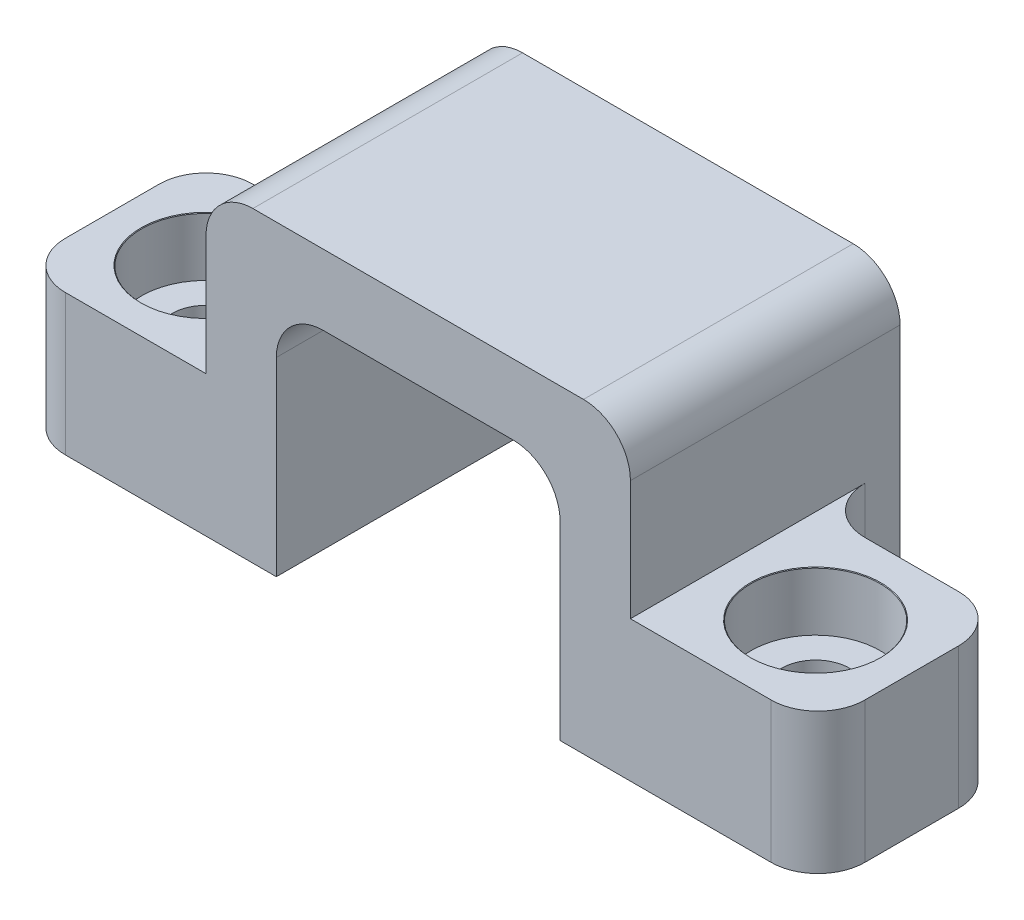
ISO-10303-21;
HEADER;
FILE_DESCRIPTION(('STEP AP214'),'2;1');
FILE_NAME('part.step','',(''),(''),'','','');
FILE_SCHEMA(('AUTOMOTIVE_DESIGN { 1 0 10303 214 1 1 1 1 }'));
ENDSEC;
DATA;
#1=APPLICATION_CONTEXT('core data for automotive mechanical design processes');
#2=APPLICATION_PROTOCOL_DEFINITION('international standard','automotive_design',2000,#1);
#3=PRODUCT_CONTEXT('',#1,'mechanical');
#4=PRODUCT('Part','Part','',(#3));
#5=PRODUCT_RELATED_PRODUCT_CATEGORY('part','',(#4));
#6=PRODUCT_DEFINITION_FORMATION('','',#4);
#7=PRODUCT_DEFINITION_CONTEXT('part definition',#1,'design');
#8=PRODUCT_DEFINITION('design','',#6,#7);
#9=PRODUCT_DEFINITION_SHAPE('','',#8);
#10=(LENGTH_UNIT() NAMED_UNIT(*) SI_UNIT(.MILLI.,.METRE.));
#11=(NAMED_UNIT(*) PLANE_ANGLE_UNIT() SI_UNIT($,.RADIAN.));
#12=(NAMED_UNIT(*) SI_UNIT($,.STERADIAN.) SOLID_ANGLE_UNIT());
#13=UNCERTAINTY_MEASURE_WITH_UNIT(LENGTH_MEASURE(1.E-05),#10,'distance_accuracy_value','');
#14=(GEOMETRIC_REPRESENTATION_CONTEXT(3) GLOBAL_UNCERTAINTY_ASSIGNED_CONTEXT((#13)) GLOBAL_UNIT_ASSIGNED_CONTEXT((#10,
#11,#12)) REPRESENTATION_CONTEXT('',''));
#15=CARTESIAN_POINT('',(0.,0.,0.));
#16=DIRECTION('',(0.,0.,1.));
#17=DIRECTION('',(1.,0.,0.));
#18=AXIS2_PLACEMENT_3D('',#15,#16,#17);
#19=CARTESIAN_POINT('',(9.05,0.,11.5));
#20=DIRECTION('',(-1.,0.,0.));
#21=DIRECTION('',(0.,-1.,0.));
#22=AXIS2_PLACEMENT_3D('',#19,#20,#21);
#23=PLANE('',#22);
#24=DIRECTION('',(0.,1.,0.));
#25=VECTOR('',#24,1.);
#26=CARTESIAN_POINT('',(9.05,0.,0.));
#27=LINE('',#26,#25);
#28=CARTESIAN_POINT('',(9.05,0.,0.));
#29=VERTEX_POINT('',#28);
#30=CARTESIAN_POINT('',(9.05,11.1,0.));
#31=VERTEX_POINT('',#30);
#32=EDGE_CURVE('E275',#29,#31,#27,.T.);
#33=ORIENTED_EDGE('',*,*,#32,.T.);
#34=DIRECTION('',(0.,0.,-1.));
#35=VECTOR('',#34,1.);
#36=CARTESIAN_POINT('',(9.05,11.1,11.5));
#37=LINE('',#36,#35);
#38=CARTESIAN_POINT('',(9.05,11.1,11.5));
#39=VERTEX_POINT('',#38);
#40=EDGE_CURVE('E238',#31,#39,#37,.F.);
#41=ORIENTED_EDGE('',*,*,#40,.T.);
#42=DIRECTION('',(0.,1.,0.));
#43=VECTOR('',#42,1.);
#44=CARTESIAN_POINT('',(9.05,0.,11.5));
#45=LINE('',#44,#43);
#46=CARTESIAN_POINT('',(9.05,6.,11.5));
#47=VERTEX_POINT('',#46);
#48=EDGE_CURVE('E213',#47,#39,#45,.T.);
#49=ORIENTED_EDGE('',*,*,#48,.F.);
#50=DIRECTION('',(0.,0.,1.));
#51=VECTOR('',#50,1.);
#52=CARTESIAN_POINT('',(9.05,6.,3.5));
#53=LINE('',#52,#51);
#54=CARTESIAN_POINT('',(9.05,6.,1.5));
#55=VERTEX_POINT('',#54);
#56=EDGE_CURVE('E224',#55,#47,#53,.T.);
#57=ORIENTED_EDGE('',*,*,#56,.F.);
#58=DIRECTION('',(0.,-1.,0.));
#59=VECTOR('',#58,1.);
#60=CARTESIAN_POINT('',(9.05,0.,1.5));
#61=LINE('',#60,#59);
#62=CARTESIAN_POINT('',(9.05,0.,1.5));
#63=VERTEX_POINT('',#62);
#64=EDGE_CURVE('E309',#55,#63,#61,.T.);
#65=ORIENTED_EDGE('',*,*,#64,.T.);
#66=DIRECTION('',(0.,0.,-1.));
#67=VECTOR('',#66,1.);
#68=CARTESIAN_POINT('',(9.05,0.,11.5));
#69=LINE('',#68,#67);
#70=EDGE_CURVE('E246',#63,#29,#69,.T.);
#71=ORIENTED_EDGE('',*,*,#70,.T.);
#72=EDGE_LOOP('',(#33,#41,#49,#57,#65,#71));
#73=FACE_BOUND('',#72,.T.);
#74=ADVANCED_FACE('F45',(#73),#23,.F.);
#75=CARTESIAN_POINT('',(-9.05,13.1,11.5));
#76=DIRECTION('',(1.,0.,0.));
#77=DIRECTION('',(0.,1.,0.));
#78=AXIS2_PLACEMENT_3D('',#75,#76,#77);
#79=PLANE('',#78);
#80=DIRECTION('',(0.,-1.,0.));
#81=VECTOR('',#80,1.);
#82=CARTESIAN_POINT('',(-9.05,13.1,11.5));
#83=LINE('',#82,#81);
#84=CARTESIAN_POINT('',(-9.05,11.1,11.5));
#85=VERTEX_POINT('',#84);
#86=CARTESIAN_POINT('',(-9.05,6.,11.5));
#87=VERTEX_POINT('',#86);
#88=EDGE_CURVE('E282',#85,#87,#83,.T.);
#89=ORIENTED_EDGE('',*,*,#88,.F.);
#90=DIRECTION('',(0.,0.,-1.));
#91=VECTOR('',#90,1.);
#92=CARTESIAN_POINT('',(-9.05,11.1,11.5));
#93=LINE('',#92,#91);
#94=CARTESIAN_POINT('',(-9.05,11.1,0.));
#95=VERTEX_POINT('',#94);
#96=EDGE_CURVE('E330',#85,#95,#93,.T.);
#97=ORIENTED_EDGE('',*,*,#96,.T.);
#98=DIRECTION('',(0.,-1.,0.));
#99=VECTOR('',#98,1.);
#100=CARTESIAN_POINT('',(-9.05,13.1,0.));
#101=LINE('',#100,#99);
#102=CARTESIAN_POINT('',(-9.05,0.,0.));
#103=VERTEX_POINT('',#102);
#104=EDGE_CURVE('E252',#95,#103,#101,.T.);
#105=ORIENTED_EDGE('',*,*,#104,.T.);
#106=DIRECTION('',(0.,0.,-1.));
#107=VECTOR('',#106,1.);
#108=CARTESIAN_POINT('',(-9.05,0.,11.5));
#109=LINE('',#108,#107);
#110=CARTESIAN_POINT('',(-9.05,0.,1.5));
#111=VERTEX_POINT('',#110);
#112=EDGE_CURVE('E293',#111,#103,#109,.T.);
#113=ORIENTED_EDGE('',*,*,#112,.F.);
#114=DIRECTION('',(0.,1.,0.));
#115=VECTOR('',#114,1.);
#116=CARTESIAN_POINT('',(-9.05,6.,1.5));
#117=LINE('',#116,#115);
#118=CARTESIAN_POINT('',(-9.05,6.,1.5));
#119=VERTEX_POINT('',#118);
#120=EDGE_CURVE('E326',#111,#119,#117,.T.);
#121=ORIENTED_EDGE('',*,*,#120,.T.);
#122=DIRECTION('',(0.,0.,1.));
#123=VECTOR('',#122,1.);
#124=CARTESIAN_POINT('',(-9.05,6.,3.5));
#125=LINE('',#124,#123);
#126=EDGE_CURVE('E421',#119,#87,#125,.T.);
#127=ORIENTED_EDGE('',*,*,#126,.T.);
#128=EDGE_LOOP('',(#89,#97,#105,#113,#121,#127));
#129=FACE_BOUND('',#128,.T.);
#130=ADVANCED_FACE('F438',(#129),#79,.F.);
#131=CARTESIAN_POINT('',(-9.05,0.,11.5));
#132=DIRECTION('',(0.,1.,0.));
#133=DIRECTION('',(-1.,0.,0.));
#134=AXIS2_PLACEMENT_3D('',#131,#132,#133);
#135=PLANE('',#134);
#136=CARTESIAN_POINT('',(-13.05,0.,7.5));
#137=DIRECTION('',(0.,1.,0.));
#138=DIRECTION('',(0.,0.,1.));
#139=AXIS2_PLACEMENT_3D('',#136,#137,#138);
#140=CIRCLE('',#139,1.45);
#141=CARTESIAN_POINT('',(-13.05,0.,8.95));
#142=VERTEX_POINT('',#141);
#143=EDGE_CURVE('E807',#142,#142,#140,.T.);
#144=ORIENTED_EDGE('',*,*,#143,.T.);
#145=EDGE_LOOP('',(#144));
#146=FACE_BOUND('',#145,.T.);
#147=DIRECTION('',(0.,0.,1.));
#148=VECTOR('',#147,1.);
#149=CARTESIAN_POINT('',(-17.05,0.,3.5));
#150=LINE('',#149,#148);
#151=CARTESIAN_POINT('',(-17.05,0.,5.5));
#152=VERTEX_POINT('',#151);
#153=CARTESIAN_POINT('',(-17.05,0.,9.5));
#154=VERTEX_POINT('',#153);
#155=EDGE_CURVE('E257',#152,#154,#150,.T.);
#156=ORIENTED_EDGE('',*,*,#155,.F.);
#157=CARTESIAN_POINT('',(-15.05,0.,5.5));
#158=DIRECTION('',(0.,1.,0.));
#159=DIRECTION('',(-1.,0.,0.));
#160=AXIS2_PLACEMENT_3D('',#157,#158,#159);
#161=CIRCLE('',#160,2.);
#162=CARTESIAN_POINT('',(-15.05,0.,3.5));
#163=VERTEX_POINT('',#162);
#164=EDGE_CURVE('E69',#152,#163,#161,.F.);
#165=ORIENTED_EDGE('',*,*,#164,.T.);
#166=DIRECTION('',(1.,0.,0.));
#167=VECTOR('',#166,1.);
#168=CARTESIAN_POINT('',(-9.05,0.,3.5));
#169=LINE('',#168,#167);
#170=CARTESIAN_POINT('',(-11.05,0.,3.5));
#171=VERTEX_POINT('',#170);
#172=EDGE_CURVE('E430',#163,#171,#169,.T.);
#173=ORIENTED_EDGE('',*,*,#172,.T.);
#174=CARTESIAN_POINT('',(-11.05,0.,1.5));
#175=DIRECTION('',(0.,1.,0.));
#176=DIRECTION('',(-1.,0.,0.));
#177=AXIS2_PLACEMENT_3D('',#174,#175,#176);
#178=CIRCLE('',#177,2.);
#179=EDGE_CURVE('E11',#171,#111,#178,.T.);
#180=ORIENTED_EDGE('',*,*,#179,.T.);
#181=ORIENTED_EDGE('',*,*,#112,.T.);
#182=DIRECTION('',(1.,0.,0.));
#183=VECTOR('',#182,1.);
#184=CARTESIAN_POINT('',(-9.05,0.,0.));
#185=LINE('',#184,#183);
#186=CARTESIAN_POINT('',(-6.05,0.,0.));
#187=VERTEX_POINT('',#186);
#188=EDGE_CURVE('E256',#103,#187,#185,.T.);
#189=ORIENTED_EDGE('',*,*,#188,.T.);
#190=DIRECTION('',(0.,0.,-1.));
#191=VECTOR('',#190,1.);
#192=CARTESIAN_POINT('',(-6.05,0.,11.5));
#193=LINE('',#192,#191);
#194=CARTESIAN_POINT('',(-6.05,0.,11.5));
#195=VERTEX_POINT('',#194);
#196=EDGE_CURVE('E289',#195,#187,#193,.T.);
#197=ORIENTED_EDGE('',*,*,#196,.F.);
#198=DIRECTION('',(1.,0.,0.));
#199=VECTOR('',#198,1.);
#200=CARTESIAN_POINT('',(-9.05,0.,11.5));
#201=LINE('',#200,#199);
#202=CARTESIAN_POINT('',(-15.05,0.,11.5));
#203=VERTEX_POINT('',#202);
#204=EDGE_CURVE('E456',#203,#195,#201,.T.);
#205=ORIENTED_EDGE('',*,*,#204,.F.);
#206=CARTESIAN_POINT('',(-15.05,0.,9.5));
#207=DIRECTION('',(0.,1.,0.));
#208=DIRECTION('',(-1.,0.,0.));
#209=AXIS2_PLACEMENT_3D('',#206,#207,#208);
#210=CIRCLE('',#209,2.);
#211=EDGE_CURVE('E61',#203,#154,#210,.F.);
#212=ORIENTED_EDGE('',*,*,#211,.T.);
#213=EDGE_LOOP('',(#156,#165,#173,#180,#181,#189,#197,#205,#212));
#214=FACE_BOUND('',#213,.T.);
#215=ADVANCED_FACE('F435',(#146,#214),#135,.F.);
#216=CARTESIAN_POINT('',(-6.05,0.,11.5));
#217=DIRECTION('',(-1.,0.,0.));
#218=DIRECTION('',(0.,-1.,0.));
#219=AXIS2_PLACEMENT_3D('',#216,#217,#218);
#220=PLANE('',#219);
#221=DIRECTION('',(0.,1.,0.));
#222=VECTOR('',#221,1.);
#223=CARTESIAN_POINT('',(-6.05,0.,0.));
#224=LINE('',#223,#222);
#225=CARTESIAN_POINT('',(-6.05,8.1,0.));
#226=VERTEX_POINT('',#225);
#227=EDGE_CURVE('E260',#187,#226,#224,.T.);
#228=ORIENTED_EDGE('',*,*,#227,.T.);
#229=DIRECTION('',(0.,0.,-1.));
#230=VECTOR('',#229,1.);
#231=CARTESIAN_POINT('',(-6.05,8.1,11.5));
#232=LINE('',#231,#230);
#233=CARTESIAN_POINT('',(-6.05,8.1,11.5));
#234=VERTEX_POINT('',#233);
#235=EDGE_CURVE('E370',#226,#234,#232,.F.);
#236=ORIENTED_EDGE('',*,*,#235,.T.);
#237=DIRECTION('',(0.,1.,0.));
#238=VECTOR('',#237,1.);
#239=CARTESIAN_POINT('',(-6.05,0.,11.5));
#240=LINE('',#239,#238);
#241=EDGE_CURVE('E452',#195,#234,#240,.T.);
#242=ORIENTED_EDGE('',*,*,#241,.F.);
#243=ORIENTED_EDGE('',*,*,#196,.T.);
#244=EDGE_LOOP('',(#228,#236,#242,#243));
#245=FACE_BOUND('',#244,.T.);
#246=ADVANCED_FACE('F449',(#245),#220,.F.);
#247=CARTESIAN_POINT('',(-6.05,10.1,11.5));
#248=DIRECTION('',(0.,1.,0.));
#249=DIRECTION('',(-1.,0.,0.));
#250=AXIS2_PLACEMENT_3D('',#247,#248,#249);
#251=PLANE('',#250);
#252=DIRECTION('',(1.,0.,0.));
#253=VECTOR('',#252,1.);
#254=CARTESIAN_POINT('',(-6.05,10.1,0.));
#255=LINE('',#254,#253);
#256=CARTESIAN_POINT('',(-4.05,10.1,0.));
#257=VERTEX_POINT('',#256);
#258=CARTESIAN_POINT('',(4.05,10.1,0.));
#259=VERTEX_POINT('',#258);
#260=EDGE_CURVE('E264',#257,#259,#255,.T.);
#261=ORIENTED_EDGE('',*,*,#260,.T.);
#262=DIRECTION('',(0.,0.,-1.));
#263=VECTOR('',#262,1.);
#264=CARTESIAN_POINT('',(4.05,10.1,11.5));
#265=LINE('',#264,#263);
#266=CARTESIAN_POINT('',(4.05,10.1,11.5));
#267=VERTEX_POINT('',#266);
#268=EDGE_CURVE('E367',#259,#267,#265,.F.);
#269=ORIENTED_EDGE('',*,*,#268,.T.);
#270=DIRECTION('',(1.,0.,0.));
#271=VECTOR('',#270,1.);
#272=CARTESIAN_POINT('',(-6.05,10.1,11.5));
#273=LINE('',#272,#271);
#274=CARTESIAN_POINT('',(-4.05,10.1,11.5));
#275=VERTEX_POINT('',#274);
#276=EDGE_CURVE('E455',#275,#267,#273,.T.);
#277=ORIENTED_EDGE('',*,*,#276,.F.);
#278=DIRECTION('',(0.,0.,-1.));
#279=VECTOR('',#278,1.);
#280=CARTESIAN_POINT('',(-4.05,10.1,0.));
#281=LINE('',#280,#279);
#282=EDGE_CURVE('E363',#275,#257,#281,.T.);
#283=ORIENTED_EDGE('',*,*,#282,.T.);
#284=EDGE_LOOP('',(#261,#269,#277,#283));
#285=FACE_BOUND('',#284,.T.);
#286=ADVANCED_FACE('F545',(#285),#251,.F.);
#287=CARTESIAN_POINT('',(6.05,10.1,11.5));
#288=DIRECTION('',(1.,0.,0.));
#289=DIRECTION('',(0.,1.,0.));
#290=AXIS2_PLACEMENT_3D('',#287,#288,#289);
#291=PLANE('',#290);
#292=DIRECTION('',(0.,-1.,0.));
#293=VECTOR('',#292,1.);
#294=CARTESIAN_POINT('',(6.05,10.1,11.5));
#295=LINE('',#294,#293);
#296=CARTESIAN_POINT('',(6.05,8.1,11.5));
#297=VERTEX_POINT('',#296);
#298=CARTESIAN_POINT('',(6.05,0.,11.5));
#299=VERTEX_POINT('',#298);
#300=EDGE_CURVE('E248',#297,#299,#295,.T.);
#301=ORIENTED_EDGE('',*,*,#300,.F.);
#302=DIRECTION('',(0.,0.,-1.));
#303=VECTOR('',#302,1.);
#304=CARTESIAN_POINT('',(6.05,8.1,0.));
#305=LINE('',#304,#303);
#306=CARTESIAN_POINT('',(6.05,8.1,0.));
#307=VERTEX_POINT('',#306);
#308=EDGE_CURVE('E359',#297,#307,#305,.T.);
#309=ORIENTED_EDGE('',*,*,#308,.T.);
#310=DIRECTION('',(0.,-1.,0.));
#311=VECTOR('',#310,1.);
#312=CARTESIAN_POINT('',(6.05,10.1,0.));
#313=LINE('',#312,#311);
#314=CARTESIAN_POINT('',(6.05,0.,0.));
#315=VERTEX_POINT('',#314);
#316=EDGE_CURVE('E268',#307,#315,#313,.T.);
#317=ORIENTED_EDGE('',*,*,#316,.T.);
#318=DIRECTION('',(0.,0.,-1.));
#319=VECTOR('',#318,1.);
#320=CARTESIAN_POINT('',(6.05,0.,11.5));
#321=LINE('',#320,#319);
#322=EDGE_CURVE('E285',#299,#315,#321,.T.);
#323=ORIENTED_EDGE('',*,*,#322,.F.);
#324=EDGE_LOOP('',(#301,#309,#317,#323));
#325=FACE_BOUND('',#324,.T.);
#326=ADVANCED_FACE('F471',(#325),#291,.F.);
#327=CARTESIAN_POINT('',(6.05,0.,11.5));
#328=DIRECTION('',(0.,1.,0.));
#329=DIRECTION('',(-1.,0.,0.));
#330=AXIS2_PLACEMENT_3D('',#327,#328,#329);
#331=PLANE('',#330);
#332=CARTESIAN_POINT('',(13.05,0.,7.60253767599577));
#333=DIRECTION('',(0.,1.,0.));
#334=DIRECTION('',(0.,0.,1.));
#335=AXIS2_PLACEMENT_3D('',#332,#333,#334);
#336=CIRCLE('',#335,1.45);
#337=CARTESIAN_POINT('',(13.05,0.,9.05253767599577));
#338=VERTEX_POINT('',#337);
#339=EDGE_CURVE('E234',#338,#338,#336,.T.);
#340=ORIENTED_EDGE('',*,*,#339,.T.);
#341=EDGE_LOOP('',(#340));
#342=FACE_BOUND('',#341,.T.);
#343=DIRECTION('',(0.,0.,1.));
#344=VECTOR('',#343,1.);
#345=CARTESIAN_POINT('',(17.05,0.,3.5));
#346=LINE('',#345,#344);
#347=CARTESIAN_POINT('',(17.05,0.,5.5));
#348=VERTEX_POINT('',#347);
#349=CARTESIAN_POINT('',(17.05,0.,9.5));
#350=VERTEX_POINT('',#349);
#351=EDGE_CURVE('E479',#348,#350,#346,.T.);
#352=ORIENTED_EDGE('',*,*,#351,.T.);
#353=CARTESIAN_POINT('',(15.05,0.,9.5));
#354=DIRECTION('',(0.,1.,0.));
#355=DIRECTION('',(-1.,0.,0.));
#356=AXIS2_PLACEMENT_3D('',#353,#354,#355);
#357=CIRCLE('',#356,2.);
#358=CARTESIAN_POINT('',(15.05,0.,11.5));
#359=VERTEX_POINT('',#358);
#360=EDGE_CURVE('E350',#350,#359,#357,.F.);
#361=ORIENTED_EDGE('',*,*,#360,.T.);
#362=DIRECTION('',(1.,0.,0.));
#363=VECTOR('',#362,1.);
#364=CARTESIAN_POINT('',(6.05,0.,11.5));
#365=LINE('',#364,#363);
#366=EDGE_CURVE('E241',#299,#359,#365,.T.);
#367=ORIENTED_EDGE('',*,*,#366,.F.);
#368=ORIENTED_EDGE('',*,*,#322,.T.);
#369=DIRECTION('',(1.,0.,0.));
#370=VECTOR('',#369,1.);
#371=CARTESIAN_POINT('',(6.05,0.,0.));
#372=LINE('',#371,#370);
#373=EDGE_CURVE('E271',#315,#29,#372,.T.);
#374=ORIENTED_EDGE('',*,*,#373,.T.);
#375=ORIENTED_EDGE('',*,*,#70,.F.);
#376=CARTESIAN_POINT('',(11.05,0.,1.5));
#377=DIRECTION('',(0.,1.,0.));
#378=DIRECTION('',(-1.,0.,0.));
#379=AXIS2_PLACEMENT_3D('',#376,#377,#378);
#380=CIRCLE('',#379,2.);
#381=CARTESIAN_POINT('',(11.05,0.,3.5));
#382=VERTEX_POINT('',#381);
#383=EDGE_CURVE('E395',#63,#382,#380,.T.);
#384=ORIENTED_EDGE('',*,*,#383,.T.);
#385=DIRECTION('',(1.,0.,0.));
#386=VECTOR('',#385,1.);
#387=CARTESIAN_POINT('',(9.05,0.,3.5));
#388=LINE('',#387,#386);
#389=CARTESIAN_POINT('',(15.05,0.,3.5));
#390=VERTEX_POINT('',#389);
#391=EDGE_CURVE('E221',#382,#390,#388,.T.);
#392=ORIENTED_EDGE('',*,*,#391,.T.);
#393=CARTESIAN_POINT('',(15.05,0.,5.5));
#394=DIRECTION('',(0.,1.,0.));
#395=DIRECTION('',(-1.,0.,0.));
#396=AXIS2_PLACEMENT_3D('',#393,#394,#395);
#397=CIRCLE('',#396,2.);
#398=EDGE_CURVE('E347',#390,#348,#397,.F.);
#399=ORIENTED_EDGE('',*,*,#398,.T.);
#400=EDGE_LOOP('',(#352,#361,#367,#368,#374,#375,#384,#392,#399));
#401=FACE_BOUND('',#400,.T.);
#402=ADVANCED_FACE('F476',(#342,#401),#331,.F.);
#403=CARTESIAN_POINT('',(9.05,13.1,11.5));
#404=DIRECTION('',(0.,-1.,0.));
#405=DIRECTION('',(1.,0.,0.));
#406=AXIS2_PLACEMENT_3D('',#403,#404,#405);
#407=PLANE('',#406);
#408=DIRECTION('',(-1.,0.,0.));
#409=VECTOR('',#408,1.);
#410=CARTESIAN_POINT('',(9.05,13.1,11.5));
#411=LINE('',#410,#409);
#412=CARTESIAN_POINT('',(7.05,13.1,11.5));
#413=VERTEX_POINT('',#412);
#414=CARTESIAN_POINT('',(-7.05,13.1,11.5));
#415=VERTEX_POINT('',#414);
#416=EDGE_CURVE('E240',#413,#415,#411,.T.);
#417=ORIENTED_EDGE('',*,*,#416,.F.);
#418=DIRECTION('',(0.,0.,-1.));
#419=VECTOR('',#418,1.);
#420=CARTESIAN_POINT('',(7.05,13.1,11.5));
#421=LINE('',#420,#419);
#422=CARTESIAN_POINT('',(7.05,13.1,0.));
#423=VERTEX_POINT('',#422);
#424=EDGE_CURVE('E299',#413,#423,#421,.T.);
#425=ORIENTED_EDGE('',*,*,#424,.T.);
#426=DIRECTION('',(-1.,0.,0.));
#427=VECTOR('',#426,1.);
#428=CARTESIAN_POINT('',(9.05,13.1,0.));
#429=LINE('',#428,#427);
#430=CARTESIAN_POINT('',(-7.05,13.1,0.));
#431=VERTEX_POINT('',#430);
#432=EDGE_CURVE('E278',#423,#431,#429,.T.);
#433=ORIENTED_EDGE('',*,*,#432,.T.);
#434=DIRECTION('',(0.,0.,-1.));
#435=VECTOR('',#434,1.);
#436=CARTESIAN_POINT('',(-7.05,13.1,11.5));
#437=LINE('',#436,#435);
#438=EDGE_CURVE('E296',#431,#415,#437,.F.);
#439=ORIENTED_EDGE('',*,*,#438,.T.);
#440=EDGE_LOOP('',(#417,#425,#433,#439));
#441=FACE_BOUND('',#440,.T.);
#442=ADVANCED_FACE('F538',(#441),#407,.F.);
#443=CARTESIAN_POINT('',(0.,0.,11.5));
#444=DIRECTION('',(0.,0.,1.));
#445=DIRECTION('',(1.,0.,0.));
#446=AXIS2_PLACEMENT_3D('',#443,#444,#445);
#447=PLANE('',#446);
#448=ORIENTED_EDGE('',*,*,#48,.T.);
#449=CARTESIAN_POINT('',(7.05,11.1,11.5));
#450=DIRECTION('',(0.,0.,1.));
#451=DIRECTION('',(1.,0.,0.));
#452=AXIS2_PLACEMENT_3D('',#449,#450,#451);
#453=CIRCLE('',#452,2.);
#454=EDGE_CURVE('E323',#39,#413,#453,.T.);
#455=ORIENTED_EDGE('',*,*,#454,.T.);
#456=ORIENTED_EDGE('',*,*,#416,.T.);
#457=CARTESIAN_POINT('',(-7.05,11.1,11.5));
#458=DIRECTION('',(0.,0.,1.));
#459=DIRECTION('',(1.,0.,0.));
#460=AXIS2_PLACEMENT_3D('',#457,#458,#459);
#461=CIRCLE('',#460,2.);
#462=EDGE_CURVE('E320',#415,#85,#461,.T.);
#463=ORIENTED_EDGE('',*,*,#462,.T.);
#464=ORIENTED_EDGE('',*,*,#88,.T.);
#465=DIRECTION('',(-1.,0.,0.));
#466=VECTOR('',#465,1.);
#467=CARTESIAN_POINT('',(-9.05,6.,11.5));
#468=LINE('',#467,#466);
#469=CARTESIAN_POINT('',(-15.05,6.,11.5));
#470=VERTEX_POINT('',#469);
#471=EDGE_CURVE('E220',#87,#470,#468,.T.);
#472=ORIENTED_EDGE('',*,*,#471,.T.);
#473=DIRECTION('',(0.,-1.,0.));
#474=VECTOR('',#473,1.);
#475=CARTESIAN_POINT('',(-15.05,0.,11.5));
#476=LINE('',#475,#474);
#477=EDGE_CURVE('E314',#470,#203,#476,.T.);
#478=ORIENTED_EDGE('',*,*,#477,.T.);
#479=ORIENTED_EDGE('',*,*,#204,.T.);
#480=ORIENTED_EDGE('',*,*,#241,.T.);
#481=CARTESIAN_POINT('',(-4.05,8.1,11.5));
#482=DIRECTION('',(0.,0.,1.));
#483=DIRECTION('',(1.,0.,0.));
#484=AXIS2_PLACEMENT_3D('',#481,#482,#483);
#485=CIRCLE('',#484,2.);
#486=EDGE_CURVE('E409',#234,#275,#485,.F.);
#487=ORIENTED_EDGE('',*,*,#486,.T.);
#488=ORIENTED_EDGE('',*,*,#276,.T.);
#489=CARTESIAN_POINT('',(4.05,8.1,11.5));
#490=DIRECTION('',(0.,0.,1.));
#491=DIRECTION('',(1.,0.,0.));
#492=AXIS2_PLACEMENT_3D('',#489,#490,#491);
#493=CIRCLE('',#492,2.);
#494=EDGE_CURVE('E403',#267,#297,#493,.F.);
#495=ORIENTED_EDGE('',*,*,#494,.T.);
#496=ORIENTED_EDGE('',*,*,#300,.T.);
#497=ORIENTED_EDGE('',*,*,#366,.T.);
#498=DIRECTION('',(0.,1.,0.));
#499=VECTOR('',#498,1.);
#500=CARTESIAN_POINT('',(15.05,0.,11.5));
#501=LINE('',#500,#499);
#502=CARTESIAN_POINT('',(15.05,6.,11.5));
#503=VERTEX_POINT('',#502);
#504=EDGE_CURVE('E217',#359,#503,#501,.T.);
#505=ORIENTED_EDGE('',*,*,#504,.T.);
#506=DIRECTION('',(-1.,0.,0.));
#507=VECTOR('',#506,1.);
#508=CARTESIAN_POINT('',(9.05,6.,11.5));
#509=LINE('',#508,#507);
#510=EDGE_CURVE('E209',#503,#47,#509,.T.);
#511=ORIENTED_EDGE('',*,*,#510,.T.);
#512=EDGE_LOOP('',(#448,#455,#456,#463,#464,#472,#478,#479,#480,#487,#488,#495,#496,#497,#505,#511));
#513=FACE_BOUND('',#512,.T.);
#514=ADVANCED_FACE('F211',(#513),#447,.T.);
#515=CARTESIAN_POINT('',(0.,0.,0.));
#516=DIRECTION('',(0.,0.,1.));
#517=DIRECTION('',(1.,0.,0.));
#518=AXIS2_PLACEMENT_3D('',#515,#516,#517);
#519=PLANE('',#518);
#520=ORIENTED_EDGE('',*,*,#432,.F.);
#521=CARTESIAN_POINT('',(7.05,11.1,0.));
#522=DIRECTION('',(0.,0.,1.));
#523=DIRECTION('',(1.,0.,0.));
#524=AXIS2_PLACEMENT_3D('',#521,#522,#523);
#525=CIRCLE('',#524,2.);
#526=EDGE_CURVE('E306',#423,#31,#525,.F.);
#527=ORIENTED_EDGE('',*,*,#526,.T.);
#528=ORIENTED_EDGE('',*,*,#32,.F.);
#529=ORIENTED_EDGE('',*,*,#373,.F.);
#530=ORIENTED_EDGE('',*,*,#316,.F.);
#531=CARTESIAN_POINT('',(4.05,8.1,0.));
#532=DIRECTION('',(0.,0.,1.));
#533=DIRECTION('',(1.,0.,0.));
#534=AXIS2_PLACEMENT_3D('',#531,#532,#533);
#535=CIRCLE('',#534,2.);
#536=EDGE_CURVE('E400',#307,#259,#535,.T.);
#537=ORIENTED_EDGE('',*,*,#536,.T.);
#538=ORIENTED_EDGE('',*,*,#260,.F.);
#539=CARTESIAN_POINT('',(-4.05,8.1,0.));
#540=DIRECTION('',(0.,0.,1.));
#541=DIRECTION('',(1.,0.,0.));
#542=AXIS2_PLACEMENT_3D('',#539,#540,#541);
#543=CIRCLE('',#542,2.);
#544=EDGE_CURVE('E406',#257,#226,#543,.T.);
#545=ORIENTED_EDGE('',*,*,#544,.T.);
#546=ORIENTED_EDGE('',*,*,#227,.F.);
#547=ORIENTED_EDGE('',*,*,#188,.F.);
#548=ORIENTED_EDGE('',*,*,#104,.F.);
#549=CARTESIAN_POINT('',(-7.05,11.1,0.));
#550=DIRECTION('',(0.,0.,1.));
#551=DIRECTION('',(1.,0.,0.));
#552=AXIS2_PLACEMENT_3D('',#549,#550,#551);
#553=CIRCLE('',#552,2.);
#554=EDGE_CURVE('E303',#95,#431,#553,.F.);
#555=ORIENTED_EDGE('',*,*,#554,.T.);
#556=EDGE_LOOP('',(#520,#527,#528,#529,#530,#537,#538,#545,#546,#547,#548,#555));
#557=FACE_BOUND('',#556,.T.);
#558=ADVANCED_FACE('F445',(#557),#519,.F.);
#559=CARTESIAN_POINT('',(-17.05,0.,3.5));
#560=DIRECTION('',(-1.,0.,0.));
#561=DIRECTION('',(0.,0.,1.));
#562=AXIS2_PLACEMENT_3D('',#559,#560,#561);
#563=PLANE('',#562);
#564=DIRECTION('',(0.,0.,1.));
#565=VECTOR('',#564,1.);
#566=CARTESIAN_POINT('',(-17.05,6.,3.5));
#567=LINE('',#566,#565);
#568=CARTESIAN_POINT('',(-17.05,6.,5.5));
#569=VERTEX_POINT('',#568);
#570=CARTESIAN_POINT('',(-17.05,6.,9.5));
#571=VERTEX_POINT('',#570);
#572=EDGE_CURVE('E507',#569,#571,#567,.T.);
#573=ORIENTED_EDGE('',*,*,#572,.F.);
#574=DIRECTION('',(0.,-1.,0.));
#575=VECTOR('',#574,1.);
#576=CARTESIAN_POINT('',(-17.05,0.,5.5));
#577=LINE('',#576,#575);
#578=EDGE_CURVE('E382',#569,#152,#577,.T.);
#579=ORIENTED_EDGE('',*,*,#578,.T.);
#580=ORIENTED_EDGE('',*,*,#155,.T.);
#581=DIRECTION('',(0.,-1.,0.));
#582=VECTOR('',#581,1.);
#583=CARTESIAN_POINT('',(-17.05,0.,9.5));
#584=LINE('',#583,#582);
#585=EDGE_CURVE('E379',#154,#571,#584,.F.);
#586=ORIENTED_EDGE('',*,*,#585,.T.);
#587=EDGE_LOOP('',(#573,#579,#580,#586));
#588=FACE_BOUND('',#587,.T.);
#589=ADVANCED_FACE('F520',(#588),#563,.T.);
#590=CARTESIAN_POINT('',(-9.05,6.,3.5));
#591=DIRECTION('',(0.,1.,0.));
#592=DIRECTION('',(-1.,0.,0.));
#593=AXIS2_PLACEMENT_3D('',#590,#591,#592);
#594=PLANE('',#593);
#595=CARTESIAN_POINT('',(-13.05,6.,7.5));
#596=DIRECTION('',(0.,1.,0.));
#597=DIRECTION('',(0.,0.,1.));
#598=AXIS2_PLACEMENT_3D('',#595,#596,#597);
#599=CIRCLE('',#598,2.775);
#600=CARTESIAN_POINT('',(-13.05,6.,10.275));
#601=VERTEX_POINT('',#600);
#602=EDGE_CURVE('E793',#601,#601,#599,.T.);
#603=ORIENTED_EDGE('',*,*,#602,.F.);
#604=EDGE_LOOP('',(#603));
#605=FACE_BOUND('',#604,.T.);
#606=DIRECTION('',(-1.,0.,0.));
#607=VECTOR('',#606,1.);
#608=CARTESIAN_POINT('',(-9.05,6.,3.5));
#609=LINE('',#608,#607);
#610=CARTESIAN_POINT('',(-11.05,6.,3.5));
#611=VERTEX_POINT('',#610);
#612=CARTESIAN_POINT('',(-15.05,6.,3.5));
#613=VERTEX_POINT('',#612);
#614=EDGE_CURVE('E417',#611,#613,#609,.T.);
#615=ORIENTED_EDGE('',*,*,#614,.T.);
#616=CARTESIAN_POINT('',(-15.05,6.,5.5));
#617=DIRECTION('',(0.,1.,0.));
#618=DIRECTION('',(-1.,0.,0.));
#619=AXIS2_PLACEMENT_3D('',#616,#617,#618);
#620=CIRCLE('',#619,2.);
#621=EDGE_CURVE('E392',#613,#569,#620,.T.);
#622=ORIENTED_EDGE('',*,*,#621,.T.);
#623=ORIENTED_EDGE('',*,*,#572,.T.);
#624=CARTESIAN_POINT('',(-15.05,6.,9.5));
#625=DIRECTION('',(0.,1.,0.));
#626=DIRECTION('',(-1.,0.,0.));
#627=AXIS2_PLACEMENT_3D('',#624,#625,#626);
#628=CIRCLE('',#627,2.);
#629=EDGE_CURVE('E389',#571,#470,#628,.T.);
#630=ORIENTED_EDGE('',*,*,#629,.T.);
#631=ORIENTED_EDGE('',*,*,#471,.F.);
#632=ORIENTED_EDGE('',*,*,#126,.F.);
#633=CARTESIAN_POINT('',(-11.05,6.,1.5));
#634=DIRECTION('',(0.,1.,0.));
#635=DIRECTION('',(-1.,0.,0.));
#636=AXIS2_PLACEMENT_3D('',#633,#634,#635);
#637=CIRCLE('',#636,2.);
#638=EDGE_CURVE('E54',#119,#611,#637,.F.);
#639=ORIENTED_EDGE('',*,*,#638,.T.);
#640=EDGE_LOOP('',(#615,#622,#623,#630,#631,#632,#639));
#641=FACE_BOUND('',#640,.T.);
#642=ADVANCED_FACE('F416',(#605,#641),#594,.T.);
#643=CARTESIAN_POINT('',(0.,0.,3.5));
#644=DIRECTION('',(0.,0.,1.));
#645=DIRECTION('',(1.,0.,0.));
#646=AXIS2_PLACEMENT_3D('',#643,#644,#645);
#647=PLANE('',#646);
#648=ORIENTED_EDGE('',*,*,#614,.F.);
#649=DIRECTION('',(0.,1.,0.));
#650=VECTOR('',#649,1.);
#651=CARTESIAN_POINT('',(-11.05,0.,3.5));
#652=LINE('',#651,#650);
#653=EDGE_CURVE('E376',#611,#171,#652,.F.);
#654=ORIENTED_EDGE('',*,*,#653,.T.);
#655=ORIENTED_EDGE('',*,*,#172,.F.);
#656=DIRECTION('',(0.,-1.,0.));
#657=VECTOR('',#656,1.);
#658=CARTESIAN_POINT('',(-15.05,6.,3.5));
#659=LINE('',#658,#657);
#660=EDGE_CURVE('E373',#163,#613,#659,.F.);
#661=ORIENTED_EDGE('',*,*,#660,.T.);
#662=EDGE_LOOP('',(#648,#654,#655,#661));
#663=FACE_BOUND('',#662,.T.);
#664=ADVANCED_FACE('F426',(#663),#647,.F.);
#665=CARTESIAN_POINT('',(9.05,6.,3.5));
#666=DIRECTION('',(0.,1.,0.));
#667=DIRECTION('',(-1.,0.,0.));
#668=AXIS2_PLACEMENT_3D('',#665,#666,#667);
#669=PLANE('',#668);
#670=CARTESIAN_POINT('',(13.05,6.,7.60253767599577));
#671=DIRECTION('',(0.,1.,0.));
#672=DIRECTION('',(0.,0.,1.));
#673=AXIS2_PLACEMENT_3D('',#670,#671,#672);
#674=CIRCLE('',#673,2.775);
#675=CARTESIAN_POINT('',(13.05,6.,10.3775376759958));
#676=VERTEX_POINT('',#675);
#677=EDGE_CURVE('E811',#676,#676,#674,.T.);
#678=ORIENTED_EDGE('',*,*,#677,.F.);
#679=EDGE_LOOP('',(#678));
#680=FACE_BOUND('',#679,.T.);
#681=ORIENTED_EDGE('',*,*,#510,.F.);
#682=CARTESIAN_POINT('',(15.05,6.,9.5));
#683=DIRECTION('',(0.,1.,0.));
#684=DIRECTION('',(-1.,0.,0.));
#685=AXIS2_PLACEMENT_3D('',#682,#683,#684);
#686=CIRCLE('',#685,2.);
#687=CARTESIAN_POINT('',(17.05,6.,9.5));
#688=VERTEX_POINT('',#687);
#689=EDGE_CURVE('E337',#503,#688,#686,.T.);
#690=ORIENTED_EDGE('',*,*,#689,.T.);
#691=DIRECTION('',(0.,0.,1.));
#692=VECTOR('',#691,1.);
#693=CARTESIAN_POINT('',(17.05,6.,3.5));
#694=LINE('',#693,#692);
#695=CARTESIAN_POINT('',(17.05,6.,5.5));
#696=VERTEX_POINT('',#695);
#697=EDGE_CURVE('E233',#696,#688,#694,.T.);
#698=ORIENTED_EDGE('',*,*,#697,.F.);
#699=CARTESIAN_POINT('',(15.05,6.,5.5));
#700=DIRECTION('',(0.,1.,0.));
#701=DIRECTION('',(-1.,0.,0.));
#702=AXIS2_PLACEMENT_3D('',#699,#700,#701);
#703=CIRCLE('',#702,2.);
#704=CARTESIAN_POINT('',(15.05,6.,3.5));
#705=VERTEX_POINT('',#704);
#706=EDGE_CURVE('E334',#696,#705,#703,.T.);
#707=ORIENTED_EDGE('',*,*,#706,.T.);
#708=DIRECTION('',(-1.,0.,0.));
#709=VECTOR('',#708,1.);
#710=CARTESIAN_POINT('',(9.05,6.,3.5));
#711=LINE('',#710,#709);
#712=CARTESIAN_POINT('',(11.05,6.,3.5));
#713=VERTEX_POINT('',#712);
#714=EDGE_CURVE('E491',#705,#713,#711,.T.);
#715=ORIENTED_EDGE('',*,*,#714,.T.);
#716=CARTESIAN_POINT('',(11.05,6.,1.5));
#717=DIRECTION('',(0.,1.,0.));
#718=DIRECTION('',(-1.,0.,0.));
#719=AXIS2_PLACEMENT_3D('',#716,#717,#718);
#720=CIRCLE('',#719,2.);
#721=EDGE_CURVE('E228',#713,#55,#720,.F.);
#722=ORIENTED_EDGE('',*,*,#721,.T.);
#723=ORIENTED_EDGE('',*,*,#56,.T.);
#724=EDGE_LOOP('',(#681,#690,#698,#707,#715,#722,#723));
#725=FACE_BOUND('',#724,.T.);
#726=ADVANCED_FACE('F225',(#680,#725),#669,.T.);
#727=CARTESIAN_POINT('',(17.05,0.,3.5));
#728=DIRECTION('',(1.,0.,0.));
#729=DIRECTION('',(0.,0.,-1.));
#730=AXIS2_PLACEMENT_3D('',#727,#728,#729);
#731=PLANE('',#730);
#732=ORIENTED_EDGE('',*,*,#697,.T.);
#733=DIRECTION('',(0.,1.,0.));
#734=VECTOR('',#733,1.);
#735=CARTESIAN_POINT('',(17.05,0.,9.5));
#736=LINE('',#735,#734);
#737=EDGE_CURVE('E344',#688,#350,#736,.F.);
#738=ORIENTED_EDGE('',*,*,#737,.T.);
#739=ORIENTED_EDGE('',*,*,#351,.F.);
#740=DIRECTION('',(0.,1.,0.));
#741=VECTOR('',#740,1.);
#742=CARTESIAN_POINT('',(17.05,0.,5.5));
#743=LINE('',#742,#741);
#744=EDGE_CURVE('E340',#348,#696,#743,.T.);
#745=ORIENTED_EDGE('',*,*,#744,.T.);
#746=EDGE_LOOP('',(#732,#738,#739,#745));
#747=FACE_BOUND('',#746,.T.);
#748=ADVANCED_FACE('F486',(#747),#731,.T.);
#749=CARTESIAN_POINT('',(0.,0.,3.5));
#750=DIRECTION('',(0.,0.,-1.));
#751=DIRECTION('',(-1.,0.,0.));
#752=AXIS2_PLACEMENT_3D('',#749,#750,#751);
#753=PLANE('',#752);
#754=ORIENTED_EDGE('',*,*,#714,.F.);
#755=DIRECTION('',(0.,1.,0.));
#756=VECTOR('',#755,1.);
#757=CARTESIAN_POINT('',(15.05,0.,3.5));
#758=LINE('',#757,#756);
#759=EDGE_CURVE('E356',#705,#390,#758,.F.);
#760=ORIENTED_EDGE('',*,*,#759,.T.);
#761=ORIENTED_EDGE('',*,*,#391,.F.);
#762=DIRECTION('',(0.,-1.,0.));
#763=VECTOR('',#762,1.);
#764=CARTESIAN_POINT('',(11.05,0.,3.5));
#765=LINE('',#764,#763);
#766=EDGE_CURVE('E353',#382,#713,#765,.F.);
#767=ORIENTED_EDGE('',*,*,#766,.T.);
#768=EDGE_LOOP('',(#754,#760,#761,#767));
#769=FACE_BOUND('',#768,.T.);
#770=ADVANCED_FACE('F591',(#769),#753,.T.);
#771=CARTESIAN_POINT('',(13.05,6.,7.60253767599577));
#772=DIRECTION('',(0.,1.,0.));
#773=DIRECTION('',(0.,0.,1.));
#774=AXIS2_PLACEMENT_3D('',#771,#772,#773);
#775=CYLINDRICAL_SURFACE('',#774,1.45);
#776=ORIENTED_EDGE('',*,*,#339,.F.);
#777=EDGE_LOOP('',(#776));
#778=FACE_BOUND('',#777,.T.);
#779=CARTESIAN_POINT('',(13.05,3.5,7.60253767599577));
#780=DIRECTION('',(0.,1.,0.));
#781=DIRECTION('',(0.,0.,1.));
#782=AXIS2_PLACEMENT_3D('',#779,#780,#781);
#783=CIRCLE('',#782,1.45);
#784=CARTESIAN_POINT('',(13.05,3.5,9.05253767599577));
#785=VERTEX_POINT('',#784);
#786=EDGE_CURVE('E823',#785,#785,#783,.T.);
#787=ORIENTED_EDGE('',*,*,#786,.T.);
#788=EDGE_LOOP('',(#787));
#789=FACE_BOUND('',#788,.T.);
#790=ADVANCED_FACE('F595',(#778,#789),#775,.F.);
#791=CARTESIAN_POINT('',(15.8,3.5,7.60253767599577));
#792=DIRECTION('',(0.,-1.,0.));
#793=DIRECTION('',(0.,0.,-1.));
#794=AXIS2_PLACEMENT_3D('',#791,#792,#793);
#795=PLANE('',#794);
#796=ORIENTED_EDGE('',*,*,#786,.F.);
#797=EDGE_LOOP('',(#796));
#798=FACE_BOUND('',#797,.T.);
#799=CARTESIAN_POINT('',(13.05,3.5,7.60253767599577));
#800=DIRECTION('',(0.,1.,0.));
#801=DIRECTION('',(0.,0.,1.));
#802=AXIS2_PLACEMENT_3D('',#799,#800,#801);
#803=CIRCLE('',#802,2.75);
#804=CARTESIAN_POINT('',(13.05,3.5,10.3525376759958));
#805=VERTEX_POINT('',#804);
#806=EDGE_CURVE('E819',#805,#805,#803,.T.);
#807=ORIENTED_EDGE('',*,*,#806,.T.);
#808=EDGE_LOOP('',(#807));
#809=FACE_BOUND('',#808,.T.);
#810=ADVANCED_FACE('F601',(#798,#809),#795,.F.);
#811=CARTESIAN_POINT('',(13.05,6.,7.60253767599577));
#812=DIRECTION('',(0.,1.,0.));
#813=DIRECTION('',(0.,0.,1.));
#814=AXIS2_PLACEMENT_3D('',#811,#812,#813);
#815=CYLINDRICAL_SURFACE('',#814,2.75);
#816=ORIENTED_EDGE('',*,*,#806,.F.);
#817=EDGE_LOOP('',(#816));
#818=FACE_BOUND('',#817,.T.);
#819=CARTESIAN_POINT('',(13.05,5.975,7.60253767599577));
#820=DIRECTION('',(0.,1.,0.));
#821=DIRECTION('',(0.,0.,1.));
#822=AXIS2_PLACEMENT_3D('',#819,#820,#821);
#823=CIRCLE('',#822,2.75);
#824=CARTESIAN_POINT('',(13.05,5.975,10.3525376759958));
#825=VERTEX_POINT('',#824);
#826=EDGE_CURVE('E815',#825,#825,#823,.T.);
#827=ORIENTED_EDGE('',*,*,#826,.T.);
#828=EDGE_LOOP('',(#827));
#829=FACE_BOUND('',#828,.T.);
#830=ADVANCED_FACE('F670',(#818,#829),#815,.F.);
#831=CARTESIAN_POINT('',(13.05,6.,7.60253767599577));
#832=DIRECTION('',(0.,1.,0.));
#833=DIRECTION('',(0.,0.,1.));
#834=AXIS2_PLACEMENT_3D('',#831,#832,#833);
#835=CONICAL_SURFACE('',#834,2.775,0.785398163397431);
#836=ORIENTED_EDGE('',*,*,#826,.F.);
#837=EDGE_LOOP('',(#836));
#838=FACE_BOUND('',#837,.T.);
#839=ORIENTED_EDGE('',*,*,#677,.T.);
#840=EDGE_LOOP('',(#839));
#841=FACE_BOUND('',#840,.T.);
#842=ADVANCED_FACE('F680',(#838,#841),#835,.F.);
#843=CARTESIAN_POINT('',(-13.05,6.,7.5));
#844=DIRECTION('',(0.,1.,0.));
#845=DIRECTION('',(0.,0.,1.));
#846=AXIS2_PLACEMENT_3D('',#843,#844,#845);
#847=CYLINDRICAL_SURFACE('',#846,1.45);
#848=ORIENTED_EDGE('',*,*,#143,.F.);
#849=EDGE_LOOP('',(#848));
#850=FACE_BOUND('',#849,.T.);
#851=CARTESIAN_POINT('',(-13.05,3.5,7.5));
#852=DIRECTION('',(0.,1.,0.));
#853=DIRECTION('',(0.,0.,1.));
#854=AXIS2_PLACEMENT_3D('',#851,#852,#853);
#855=CIRCLE('',#854,1.45);
#856=CARTESIAN_POINT('',(-13.05,3.5,8.95));
#857=VERTEX_POINT('',#856);
#858=EDGE_CURVE('E803',#857,#857,#855,.T.);
#859=ORIENTED_EDGE('',*,*,#858,.T.);
#860=EDGE_LOOP('',(#859));
#861=FACE_BOUND('',#860,.T.);
#862=ADVANCED_FACE('F690',(#850,#861),#847,.F.);
#863=CARTESIAN_POINT('',(-10.3,3.5,7.5));
#864=DIRECTION('',(0.,-1.,0.));
#865=DIRECTION('',(0.,0.,-1.));
#866=AXIS2_PLACEMENT_3D('',#863,#864,#865);
#867=PLANE('',#866);
#868=ORIENTED_EDGE('',*,*,#858,.F.);
#869=EDGE_LOOP('',(#868));
#870=FACE_BOUND('',#869,.T.);
#871=CARTESIAN_POINT('',(-13.05,3.5,7.5));
#872=DIRECTION('',(0.,1.,0.));
#873=DIRECTION('',(0.,0.,1.));
#874=AXIS2_PLACEMENT_3D('',#871,#872,#873);
#875=CIRCLE('',#874,2.75);
#876=CARTESIAN_POINT('',(-13.05,3.5,10.25));
#877=VERTEX_POINT('',#876);
#878=EDGE_CURVE('E797',#877,#877,#875,.T.);
#879=ORIENTED_EDGE('',*,*,#878,.T.);
#880=EDGE_LOOP('',(#879));
#881=FACE_BOUND('',#880,.T.);
#882=ADVANCED_FACE('F700',(#870,#881),#867,.F.);
#883=CARTESIAN_POINT('',(-13.05,6.,7.5));
#884=DIRECTION('',(0.,1.,0.));
#885=DIRECTION('',(0.,0.,1.));
#886=AXIS2_PLACEMENT_3D('',#883,#884,#885);
#887=CYLINDRICAL_SURFACE('',#886,2.75);
#888=ORIENTED_EDGE('',*,*,#878,.F.);
#889=EDGE_LOOP('',(#888));
#890=FACE_BOUND('',#889,.T.);
#891=CARTESIAN_POINT('',(-13.05,5.975,7.5));
#892=DIRECTION('',(0.,1.,0.));
#893=DIRECTION('',(0.,0.,1.));
#894=AXIS2_PLACEMENT_3D('',#891,#892,#893);
#895=CIRCLE('',#894,2.75);
#896=CARTESIAN_POINT('',(-13.05,5.975,10.25));
#897=VERTEX_POINT('',#896);
#898=EDGE_CURVE('E790',#897,#897,#895,.T.);
#899=ORIENTED_EDGE('',*,*,#898,.T.);
#900=EDGE_LOOP('',(#899));
#901=FACE_BOUND('',#900,.T.);
#902=ADVANCED_FACE('F710',(#890,#901),#887,.F.);
#903=CARTESIAN_POINT('',(-13.05,6.,7.5));
#904=DIRECTION('',(0.,1.,0.));
#905=DIRECTION('',(0.,0.,1.));
#906=AXIS2_PLACEMENT_3D('',#903,#904,#905);
#907=CONICAL_SURFACE('',#906,2.775,0.785398163397431);
#908=ORIENTED_EDGE('',*,*,#898,.F.);
#909=EDGE_LOOP('',(#908));
#910=FACE_BOUND('',#909,.T.);
#911=ORIENTED_EDGE('',*,*,#602,.T.);
#912=EDGE_LOOP('',(#911));
#913=FACE_BOUND('',#912,.T.);
#914=ADVANCED_FACE('F558',(#910,#913),#907,.F.);
#915=CARTESIAN_POINT('',(7.05,11.1,11.5));
#916=DIRECTION('',(0.,0.,-1.));
#917=DIRECTION('',(-1.,0.,0.));
#918=AXIS2_PLACEMENT_3D('',#915,#916,#917);
#919=CYLINDRICAL_SURFACE('',#918,2.);
#920=ORIENTED_EDGE('',*,*,#454,.F.);
#921=ORIENTED_EDGE('',*,*,#40,.F.);
#922=ORIENTED_EDGE('',*,*,#526,.F.);
#923=ORIENTED_EDGE('',*,*,#424,.F.);
#924=EDGE_LOOP('',(#920,#921,#922,#923));
#925=FACE_BOUND('',#924,.T.);
#926=ADVANCED_FACE('F554',(#925),#919,.T.);
#927=CARTESIAN_POINT('',(-7.05,11.1,11.5));
#928=DIRECTION('',(0.,0.,-1.));
#929=DIRECTION('',(-1.,0.,0.));
#930=AXIS2_PLACEMENT_3D('',#927,#928,#929);
#931=CYLINDRICAL_SURFACE('',#930,2.);
#932=ORIENTED_EDGE('',*,*,#462,.F.);
#933=ORIENTED_EDGE('',*,*,#438,.F.);
#934=ORIENTED_EDGE('',*,*,#554,.F.);
#935=ORIENTED_EDGE('',*,*,#96,.F.);
#936=EDGE_LOOP('',(#932,#933,#934,#935));
#937=FACE_BOUND('',#936,.T.);
#938=ADVANCED_FACE('F557',(#937),#931,.T.);
#939=CARTESIAN_POINT('',(15.05,0.,9.5));
#940=DIRECTION('',(0.,1.,0.));
#941=DIRECTION('',(0.,0.,1.));
#942=AXIS2_PLACEMENT_3D('',#939,#940,#941);
#943=CYLINDRICAL_SURFACE('',#942,2.);
#944=ORIENTED_EDGE('',*,*,#360,.F.);
#945=ORIENTED_EDGE('',*,*,#737,.F.);
#946=ORIENTED_EDGE('',*,*,#689,.F.);
#947=ORIENTED_EDGE('',*,*,#504,.F.);
#948=EDGE_LOOP('',(#944,#945,#946,#947));
#949=FACE_BOUND('',#948,.T.);
#950=ADVANCED_FACE('F482',(#949),#943,.T.);
#951=CARTESIAN_POINT('',(15.05,0.,5.5));
#952=DIRECTION('',(0.,1.,0.));
#953=DIRECTION('',(0.,0.,1.));
#954=AXIS2_PLACEMENT_3D('',#951,#952,#953);
#955=CYLINDRICAL_SURFACE('',#954,2.);
#956=ORIENTED_EDGE('',*,*,#398,.F.);
#957=ORIENTED_EDGE('',*,*,#759,.F.);
#958=ORIENTED_EDGE('',*,*,#706,.F.);
#959=ORIENTED_EDGE('',*,*,#744,.F.);
#960=EDGE_LOOP('',(#956,#957,#958,#959));
#961=FACE_BOUND('',#960,.T.);
#962=ADVANCED_FACE('F565',(#961),#955,.T.);
#963=CARTESIAN_POINT('',(11.05,0.,1.5));
#964=DIRECTION('',(0.,-1.,0.));
#965=DIRECTION('',(1.,0.,0.));
#966=AXIS2_PLACEMENT_3D('',#963,#964,#965);
#967=CYLINDRICAL_SURFACE('',#966,2.);
#968=ORIENTED_EDGE('',*,*,#721,.F.);
#969=ORIENTED_EDGE('',*,*,#766,.F.);
#970=ORIENTED_EDGE('',*,*,#383,.F.);
#971=ORIENTED_EDGE('',*,*,#64,.F.);
#972=EDGE_LOOP('',(#968,#969,#970,#971));
#973=FACE_BOUND('',#972,.T.);
#974=ADVANCED_FACE('F568',(#973),#967,.F.);
#975=CARTESIAN_POINT('',(4.05,8.1,11.5));
#976=DIRECTION('',(0.,0.,1.));
#977=DIRECTION('',(1.,0.,0.));
#978=AXIS2_PLACEMENT_3D('',#975,#976,#977);
#979=CYLINDRICAL_SURFACE('',#978,2.);
#980=ORIENTED_EDGE('',*,*,#494,.F.);
#981=ORIENTED_EDGE('',*,*,#268,.F.);
#982=ORIENTED_EDGE('',*,*,#536,.F.);
#983=ORIENTED_EDGE('',*,*,#308,.F.);
#984=EDGE_LOOP('',(#980,#981,#982,#983));
#985=FACE_BOUND('',#984,.T.);
#986=ADVANCED_FACE('F572',(#985),#979,.F.);
#987=CARTESIAN_POINT('',(-4.05,8.1,11.5));
#988=DIRECTION('',(0.,0.,1.));
#989=DIRECTION('',(1.,0.,0.));
#990=AXIS2_PLACEMENT_3D('',#987,#988,#989);
#991=CYLINDRICAL_SURFACE('',#990,2.);
#992=ORIENTED_EDGE('',*,*,#486,.F.);
#993=ORIENTED_EDGE('',*,*,#235,.F.);
#994=ORIENTED_EDGE('',*,*,#544,.F.);
#995=ORIENTED_EDGE('',*,*,#282,.F.);
#996=EDGE_LOOP('',(#992,#993,#994,#995));
#997=FACE_BOUND('',#996,.T.);
#998=ADVANCED_FACE('F527',(#997),#991,.F.);
#999=CARTESIAN_POINT('',(-11.05,13.1,1.5));
#1000=DIRECTION('',(0.,-1.,0.));
#1001=DIRECTION('',(1.,0.,0.));
#1002=AXIS2_PLACEMENT_3D('',#999,#1000,#1001);
#1003=CYLINDRICAL_SURFACE('',#1002,2.);
#1004=ORIENTED_EDGE('',*,*,#179,.F.);
#1005=ORIENTED_EDGE('',*,*,#653,.F.);
#1006=ORIENTED_EDGE('',*,*,#638,.F.);
#1007=ORIENTED_EDGE('',*,*,#120,.F.);
#1008=EDGE_LOOP('',(#1004,#1005,#1006,#1007));
#1009=FACE_BOUND('',#1008,.T.);
#1010=ADVANCED_FACE('F433',(#1009),#1003,.F.);
#1011=CARTESIAN_POINT('',(-15.05,0.,5.5));
#1012=DIRECTION('',(0.,1.,0.));
#1013=DIRECTION('',(0.,0.,1.));
#1014=AXIS2_PLACEMENT_3D('',#1011,#1012,#1013);
#1015=CYLINDRICAL_SURFACE('',#1014,2.);
#1016=ORIENTED_EDGE('',*,*,#621,.F.);
#1017=ORIENTED_EDGE('',*,*,#660,.F.);
#1018=ORIENTED_EDGE('',*,*,#164,.F.);
#1019=ORIENTED_EDGE('',*,*,#578,.F.);
#1020=EDGE_LOOP('',(#1016,#1017,#1018,#1019));
#1021=FACE_BOUND('',#1020,.T.);
#1022=ADVANCED_FACE('F521',(#1021),#1015,.T.);
#1023=CARTESIAN_POINT('',(-15.05,0.,9.5));
#1024=DIRECTION('',(0.,-1.,0.));
#1025=DIRECTION('',(0.,0.,-1.));
#1026=AXIS2_PLACEMENT_3D('',#1023,#1024,#1025);
#1027=CYLINDRICAL_SURFACE('',#1026,2.);
#1028=ORIENTED_EDGE('',*,*,#629,.F.);
#1029=ORIENTED_EDGE('',*,*,#585,.F.);
#1030=ORIENTED_EDGE('',*,*,#211,.F.);
#1031=ORIENTED_EDGE('',*,*,#477,.F.);
#1032=EDGE_LOOP('',(#1028,#1029,#1030,#1031));
#1033=FACE_BOUND('',#1032,.T.);
#1034=ADVANCED_FACE('F47',(#1033),#1027,.T.);
#1035=CLOSED_SHELL('',(#74,#130,#215,#246,#286,#326,#402,#442,#514,#558,#589,#642,#664,#726,
#748,#770,#790,#810,#830,#842,#862,#882,#902,#914,#926,#938,#950,#962,#974,#986,#998,#1010,
#1022,#1034));
#1036=MANIFOLD_SOLID_BREP('B2',#1035);
#1037=ADVANCED_BREP_SHAPE_REPRESENTATION('',(#18,#1036),#14);
#1038=SHAPE_DEFINITION_REPRESENTATION(#9,#1037);
ENDSEC;
END-ISO-10303-21;
